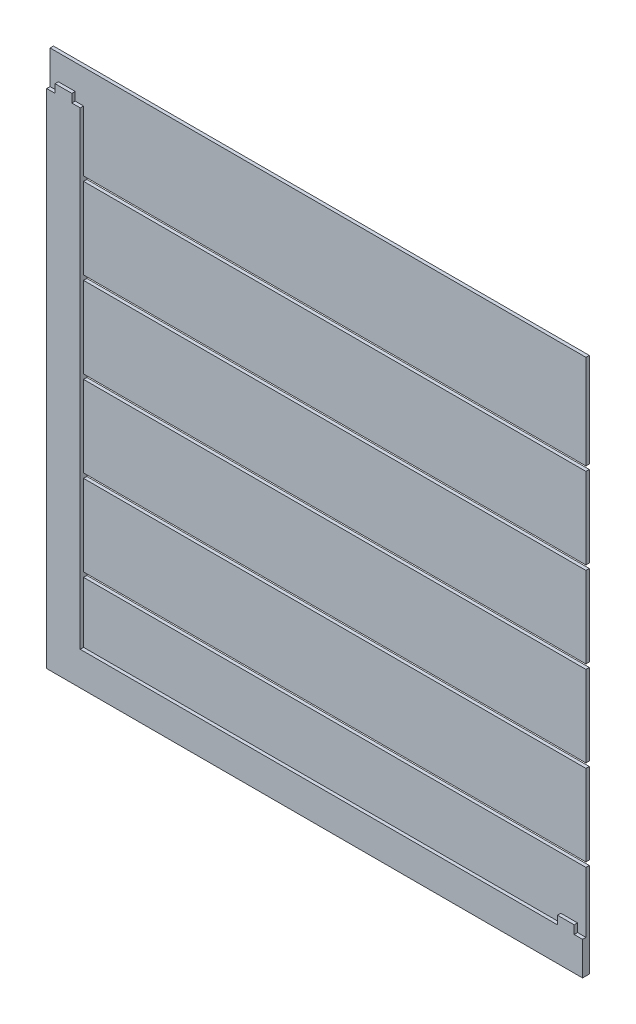
ISO-10303-21;
HEADER;
FILE_DESCRIPTION(('STEP AP214'),'2;1');
FILE_NAME('part.step','',(''),(''),'','','');
FILE_SCHEMA(('AUTOMOTIVE_DESIGN { 1 0 10303 214 1 1 1 1 }'));
ENDSEC;
DATA;
#1=APPLICATION_CONTEXT('core data for automotive mechanical design processes');
#2=APPLICATION_PROTOCOL_DEFINITION('international standard','automotive_design',2000,#1);
#3=PRODUCT_CONTEXT('',#1,'mechanical');
#4=PRODUCT('Part','Part','',(#3));
#5=PRODUCT_RELATED_PRODUCT_CATEGORY('part','',(#4));
#6=PRODUCT_DEFINITION_FORMATION('','',#4);
#7=PRODUCT_DEFINITION_CONTEXT('part definition',#1,'design');
#8=PRODUCT_DEFINITION('design','',#6,#7);
#9=PRODUCT_DEFINITION_SHAPE('','',#8);
#10=(LENGTH_UNIT() NAMED_UNIT(*) SI_UNIT(.MILLI.,.METRE.));
#11=(NAMED_UNIT(*) PLANE_ANGLE_UNIT() SI_UNIT($,.RADIAN.));
#12=(NAMED_UNIT(*) SI_UNIT($,.STERADIAN.) SOLID_ANGLE_UNIT());
#13=UNCERTAINTY_MEASURE_WITH_UNIT(LENGTH_MEASURE(1.E-05),#10,'distance_accuracy_value','');
#14=(GEOMETRIC_REPRESENTATION_CONTEXT(3) GLOBAL_UNCERTAINTY_ASSIGNED_CONTEXT((#13)) GLOBAL_UNIT_ASSIGNED_CONTEXT((#10,
#11,#12)) REPRESENTATION_CONTEXT('',''));
#15=CARTESIAN_POINT('',(0.,0.,0.));
#16=DIRECTION('',(0.,0.,1.));
#17=DIRECTION('',(1.,0.,0.));
#18=AXIS2_PLACEMENT_3D('',#15,#16,#17);
#19=CARTESIAN_POINT('',(0.,0.,1.));
#20=DIRECTION('',(0.,0.,1.));
#21=DIRECTION('',(1.,0.,0.));
#22=AXIS2_PLACEMENT_3D('',#19,#20,#21);
#23=PLANE('',#22);
#24=DIRECTION('',(0.,1.,0.));
#25=VECTOR('',#24,1.);
#26=CARTESIAN_POINT('',(-75.,-70.0313827048751,1.));
#27=LINE('',#26,#25);
#28=CARTESIAN_POINT('',(-75.,-50.5313827048751,1.));
#29=VERTEX_POINT('',#28);
#30=CARTESIAN_POINT('',(-75.,-26.3313827048751,1.));
#31=VERTEX_POINT('',#30);
#32=EDGE_CURVE('E11',#29,#31,#27,.T.);
#33=ORIENTED_EDGE('',*,*,#32,.F.);
#34=DIRECTION('',(1.,0.,0.));
#35=VECTOR('',#34,1.);
#36=CARTESIAN_POINT('',(0.,-50.5313827048751,1.));
#37=LINE('',#36,#35);
#38=CARTESIAN_POINT('',(75.,-50.5313827048751,1.));
#39=VERTEX_POINT('',#38);
#40=EDGE_CURVE('E389',#29,#39,#37,.T.);
#41=ORIENTED_EDGE('',*,*,#40,.T.);
#42=DIRECTION('',(0.,-1.,0.));
#43=VECTOR('',#42,1.);
#44=CARTESIAN_POINT('',(75.,0.,1.));
#45=LINE('',#44,#43);
#46=CARTESIAN_POINT('',(75.,-26.3313827048751,1.));
#47=VERTEX_POINT('',#46);
#48=EDGE_CURVE('E392',#47,#39,#45,.T.);
#49=ORIENTED_EDGE('',*,*,#48,.F.);
#50=DIRECTION('',(1.,0.,0.));
#51=VECTOR('',#50,1.);
#52=CARTESIAN_POINT('',(0.,-26.3313827048751,1.));
#53=LINE('',#52,#51);
#54=EDGE_CURVE('E395',#31,#47,#53,.T.);
#55=ORIENTED_EDGE('',*,*,#54,.F.);
#56=EDGE_LOOP('',(#33,#41,#49,#55));
#57=FACE_BOUND('',#56,.T.);
#58=ADVANCED_FACE('F38',(#57),#23,.T.);
#59=CARTESIAN_POINT('',(-75.,-24.9313827048751,1.));
#60=VERTEX_POINT('',#59);
#61=CARTESIAN_POINT('',(-75.,-0.731382704875112,1.));
#62=VERTEX_POINT('',#61);
#63=EDGE_CURVE('E47',#60,#62,#27,.T.);
#64=ORIENTED_EDGE('',*,*,#63,.F.);
#65=DIRECTION('',(1.,0.,0.));
#66=VECTOR('',#65,1.);
#67=CARTESIAN_POINT('',(0.,-24.9313827048751,1.));
#68=LINE('',#67,#66);
#69=CARTESIAN_POINT('',(75.,-24.9313827048751,1.));
#70=VERTEX_POINT('',#69);
#71=EDGE_CURVE('E398',#60,#70,#68,.T.);
#72=ORIENTED_EDGE('',*,*,#71,.T.);
#73=DIRECTION('',(0.,-1.,0.));
#74=VECTOR('',#73,1.);
#75=CARTESIAN_POINT('',(75.,0.,1.));
#76=LINE('',#75,#74);
#77=CARTESIAN_POINT('',(75.,-0.731382704875112,1.));
#78=VERTEX_POINT('',#77);
#79=EDGE_CURVE('E400',#78,#70,#76,.T.);
#80=ORIENTED_EDGE('',*,*,#79,.F.);
#81=DIRECTION('',(1.,0.,0.));
#82=VECTOR('',#81,1.);
#83=CARTESIAN_POINT('',(0.,-0.731382704875112,1.));
#84=LINE('',#83,#82);
#85=EDGE_CURVE('E403',#62,#78,#84,.T.);
#86=ORIENTED_EDGE('',*,*,#85,.F.);
#87=EDGE_LOOP('',(#64,#72,#80,#86));
#88=FACE_BOUND('',#87,.T.);
#89=ADVANCED_FACE('F561',(#88),#23,.T.);
#90=CARTESIAN_POINT('',(-75.,0.668617295124886,1.));
#91=VERTEX_POINT('',#90);
#92=CARTESIAN_POINT('',(-75.,24.8686172951249,1.));
#93=VERTEX_POINT('',#92);
#94=EDGE_CURVE('E550',#91,#93,#27,.T.);
#95=ORIENTED_EDGE('',*,*,#94,.F.);
#96=DIRECTION('',(1.,0.,0.));
#97=VECTOR('',#96,1.);
#98=CARTESIAN_POINT('',(0.,0.668617295124886,1.));
#99=LINE('',#98,#97);
#100=CARTESIAN_POINT('',(75.,0.668617295124886,1.));
#101=VERTEX_POINT('',#100);
#102=EDGE_CURVE('E406',#91,#101,#99,.T.);
#103=ORIENTED_EDGE('',*,*,#102,.T.);
#104=DIRECTION('',(0.,-1.,0.));
#105=VECTOR('',#104,1.);
#106=CARTESIAN_POINT('',(75.,0.,1.));
#107=LINE('',#106,#105);
#108=CARTESIAN_POINT('',(75.,24.8686172951249,1.));
#109=VERTEX_POINT('',#108);
#110=EDGE_CURVE('E408',#109,#101,#107,.T.);
#111=ORIENTED_EDGE('',*,*,#110,.F.);
#112=DIRECTION('',(1.,0.,0.));
#113=VECTOR('',#112,1.);
#114=CARTESIAN_POINT('',(0.,24.8686172951249,1.));
#115=LINE('',#114,#113);
#116=EDGE_CURVE('E411',#93,#109,#115,.T.);
#117=ORIENTED_EDGE('',*,*,#116,.F.);
#118=EDGE_LOOP('',(#95,#103,#111,#117));
#119=FACE_BOUND('',#118,.T.);
#120=ADVANCED_FACE('F578',(#119),#23,.T.);
#121=CARTESIAN_POINT('',(-75.,26.2686172951249,1.));
#122=VERTEX_POINT('',#121);
#123=CARTESIAN_POINT('',(-75.,50.4686172951249,1.));
#124=VERTEX_POINT('',#123);
#125=EDGE_CURVE('E546',#122,#124,#27,.T.);
#126=ORIENTED_EDGE('',*,*,#125,.F.);
#127=DIRECTION('',(1.,0.,0.));
#128=VECTOR('',#127,1.);
#129=CARTESIAN_POINT('',(0.,26.2686172951249,1.));
#130=LINE('',#129,#128);
#131=CARTESIAN_POINT('',(75.,26.2686172951249,1.));
#132=VERTEX_POINT('',#131);
#133=EDGE_CURVE('E414',#122,#132,#130,.T.);
#134=ORIENTED_EDGE('',*,*,#133,.T.);
#135=DIRECTION('',(0.,-1.,0.));
#136=VECTOR('',#135,1.);
#137=CARTESIAN_POINT('',(75.,0.,1.));
#138=LINE('',#137,#136);
#139=CARTESIAN_POINT('',(75.,50.4686172951249,1.));
#140=VERTEX_POINT('',#139);
#141=EDGE_CURVE('E416',#140,#132,#138,.T.);
#142=ORIENTED_EDGE('',*,*,#141,.F.);
#143=DIRECTION('',(1.,0.,0.));
#144=VECTOR('',#143,1.);
#145=CARTESIAN_POINT('',(0.,50.4686172951249,1.));
#146=LINE('',#145,#144);
#147=EDGE_CURVE('E419',#124,#140,#146,.T.);
#148=ORIENTED_EDGE('',*,*,#147,.F.);
#149=EDGE_LOOP('',(#126,#134,#142,#148));
#150=FACE_BOUND('',#149,.T.);
#151=ADVANCED_FACE('F593',(#150),#23,.T.);
#152=DIRECTION('',(-1.,0.,0.));
#153=VECTOR('',#152,1.);
#154=CARTESIAN_POINT('',(-85.,69.9686172951249,1.));
#155=LINE('',#154,#153);
#156=CARTESIAN_POINT('',(-82.5,69.9686172951249,1.));
#157=VERTEX_POINT('',#156);
#158=CARTESIAN_POINT('',(-85.,69.9686172951249,1.));
#159=VERTEX_POINT('',#158);
#160=EDGE_CURVE('E56',#157,#159,#155,.T.);
#161=ORIENTED_EDGE('',*,*,#160,.F.);
#162=DIRECTION('',(0.,-1.,0.));
#163=VECTOR('',#162,1.);
#164=CARTESIAN_POINT('',(-82.5,69.9686172951249,1.));
#165=LINE('',#164,#163);
#166=CARTESIAN_POINT('',(-82.5,72.468617295125,1.));
#167=VERTEX_POINT('',#166);
#168=EDGE_CURVE('E60',#167,#157,#165,.T.);
#169=ORIENTED_EDGE('',*,*,#168,.F.);
#170=DIRECTION('',(-1.,0.,0.));
#171=VECTOR('',#170,1.);
#172=CARTESIAN_POINT('',(-82.5,72.468617295125,1.));
#173=LINE('',#172,#171);
#174=CARTESIAN_POINT('',(-77.5,72.468617295125,1.));
#175=VERTEX_POINT('',#174);
#176=EDGE_CURVE('E349',#175,#167,#173,.T.);
#177=ORIENTED_EDGE('',*,*,#176,.F.);
#178=DIRECTION('',(0.,1.,0.));
#179=VECTOR('',#178,1.);
#180=CARTESIAN_POINT('',(-77.5,69.9686172951249,1.));
#181=LINE('',#180,#179);
#182=CARTESIAN_POINT('',(-77.5,69.9686172951249,1.));
#183=VERTEX_POINT('',#182);
#184=EDGE_CURVE('E346',#183,#175,#181,.T.);
#185=ORIENTED_EDGE('',*,*,#184,.F.);
#186=DIRECTION('',(-1.,0.,0.));
#187=VECTOR('',#186,1.);
#188=CARTESIAN_POINT('',(-77.5,69.9686172951249,1.));
#189=LINE('',#188,#187);
#190=CARTESIAN_POINT('',(-75.,69.9686172951249,1.));
#191=VERTEX_POINT('',#190);
#192=EDGE_CURVE('E342',#191,#183,#189,.T.);
#193=ORIENTED_EDGE('',*,*,#192,.F.);
#194=CARTESIAN_POINT('',(-75.,51.8686172951249,1.));
#195=VERTEX_POINT('',#194);
#196=EDGE_CURVE('E343',#195,#191,#27,.T.);
#197=ORIENTED_EDGE('',*,*,#196,.F.);
#198=DIRECTION('',(1.,0.,0.));
#199=VECTOR('',#198,1.);
#200=CARTESIAN_POINT('',(0.,51.8686172951249,1.));
#201=LINE('',#200,#199);
#202=CARTESIAN_POINT('',(75.,51.8686172951249,1.));
#203=VERTEX_POINT('',#202);
#204=EDGE_CURVE('E422',#195,#203,#201,.T.);
#205=ORIENTED_EDGE('',*,*,#204,.T.);
#206=DIRECTION('',(0.,-1.,0.));
#207=VECTOR('',#206,1.);
#208=CARTESIAN_POINT('',(75.,0.,1.));
#209=LINE('',#208,#207);
#210=CARTESIAN_POINT('',(75.,79.9686172951249,1.));
#211=VERTEX_POINT('',#210);
#212=EDGE_CURVE('E424',#211,#203,#209,.T.);
#213=ORIENTED_EDGE('',*,*,#212,.F.);
#214=DIRECTION('',(-1.,0.,0.));
#215=VECTOR('',#214,1.);
#216=CARTESIAN_POINT('',(0.,79.9686172951249,1.));
#217=LINE('',#216,#215);
#218=CARTESIAN_POINT('',(-85.,79.9686172951249,1.));
#219=VERTEX_POINT('',#218);
#220=EDGE_CURVE('E427',#211,#219,#217,.T.);
#221=ORIENTED_EDGE('',*,*,#220,.T.);
#222=DIRECTION('',(0.,-1.,0.));
#223=VECTOR('',#222,1.);
#224=CARTESIAN_POINT('',(-85.,0.,1.));
#225=LINE('',#224,#223);
#226=EDGE_CURVE('E429',#219,#159,#225,.T.);
#227=ORIENTED_EDGE('',*,*,#226,.T.);
#228=EDGE_LOOP('',(#161,#169,#177,#185,#193,#197,#205,#213,#221,#227));
#229=FACE_BOUND('',#228,.T.);
#230=ADVANCED_FACE('F607',(#229),#23,.T.);
#231=CARTESIAN_POINT('',(0.,-51.9313827048751,1.));
#232=DIRECTION('',(0.,1.,0.));
#233=DIRECTION('',(0.,0.,1.));
#234=AXIS2_PLACEMENT_3D('',#231,#232,#233);
#235=PLANE('',#234);
#236=DIRECTION('',(1.,0.,0.));
#237=VECTOR('',#236,1.);
#238=CARTESIAN_POINT('',(0.,-51.9313827048751,0.));
#239=LINE('',#238,#237);
#240=CARTESIAN_POINT('',(-75.,-51.9313827048751,0.));
#241=VERTEX_POINT('',#240);
#242=CARTESIAN_POINT('',(75.,-51.9313827048751,0.));
#243=VERTEX_POINT('',#242);
#244=EDGE_CURVE('E385',#241,#243,#239,.T.);
#245=ORIENTED_EDGE('',*,*,#244,.F.);
#246=DIRECTION('',(0.,0.,-1.));
#247=VECTOR('',#246,1.);
#248=CARTESIAN_POINT('',(-75.,-51.9313827048751,1.));
#249=LINE('',#248,#247);
#250=CARTESIAN_POINT('',(-75.,-51.9313827048751,1.));
#251=VERTEX_POINT('',#250);
#252=EDGE_CURVE('E42',#251,#241,#249,.T.);
#253=ORIENTED_EDGE('',*,*,#252,.F.);
#254=DIRECTION('',(1.,0.,0.));
#255=VECTOR('',#254,1.);
#256=CARTESIAN_POINT('',(0.,-51.9313827048751,1.));
#257=LINE('',#256,#255);
#258=CARTESIAN_POINT('',(75.,-51.9313827048751,1.));
#259=VERTEX_POINT('',#258);
#260=EDGE_CURVE('E386',#251,#259,#257,.T.);
#261=ORIENTED_EDGE('',*,*,#260,.T.);
#262=DIRECTION('',(0.,0.,-1.));
#263=VECTOR('',#262,1.);
#264=CARTESIAN_POINT('',(75.,-51.9313827048751,1.));
#265=LINE('',#264,#263);
#266=EDGE_CURVE('E284',#259,#243,#265,.T.);
#267=ORIENTED_EDGE('',*,*,#266,.T.);
#268=EDGE_LOOP('',(#245,#253,#261,#267));
#269=FACE_BOUND('',#268,.T.);
#270=ADVANCED_FACE('F40',(#269),#235,.T.);
#271=CARTESIAN_POINT('',(0.,-50.5313827048751,1.));
#272=DIRECTION('',(0.,1.,0.));
#273=DIRECTION('',(0.,0.,1.));
#274=AXIS2_PLACEMENT_3D('',#271,#272,#273);
#275=PLANE('',#274);
#276=DIRECTION('',(1.,0.,0.));
#277=VECTOR('',#276,1.);
#278=CARTESIAN_POINT('',(0.,-50.5313827048751,0.));
#279=LINE('',#278,#277);
#280=CARTESIAN_POINT('',(-75.,-50.5313827048751,0.));
#281=VERTEX_POINT('',#280);
#282=CARTESIAN_POINT('',(75.,-50.5313827048751,0.));
#283=VERTEX_POINT('',#282);
#284=EDGE_CURVE('E437',#281,#283,#279,.T.);
#285=ORIENTED_EDGE('',*,*,#284,.T.);
#286=DIRECTION('',(0.,0.,-1.));
#287=VECTOR('',#286,1.);
#288=CARTESIAN_POINT('',(75.,-50.5313827048751,1.));
#289=LINE('',#288,#287);
#290=EDGE_CURVE('E536',#39,#283,#289,.T.);
#291=ORIENTED_EDGE('',*,*,#290,.F.);
#292=ORIENTED_EDGE('',*,*,#40,.F.);
#293=DIRECTION('',(0.,0.,-1.));
#294=VECTOR('',#293,1.);
#295=CARTESIAN_POINT('',(-75.,-50.5313827048751,1.));
#296=LINE('',#295,#294);
#297=EDGE_CURVE('E537',#29,#281,#296,.T.);
#298=ORIENTED_EDGE('',*,*,#297,.T.);
#299=EDGE_LOOP('',(#285,#291,#292,#298));
#300=FACE_BOUND('',#299,.T.);
#301=ADVANCED_FACE('F645',(#300),#275,.F.);
#302=CARTESIAN_POINT('',(75.,0.,1.));
#303=DIRECTION('',(1.,0.,0.));
#304=DIRECTION('',(0.,0.,-1.));
#305=AXIS2_PLACEMENT_3D('',#302,#303,#304);
#306=PLANE('',#305);
#307=DIRECTION('',(0.,-1.,0.));
#308=VECTOR('',#307,1.);
#309=CARTESIAN_POINT('',(75.,0.,0.));
#310=LINE('',#309,#308);
#311=CARTESIAN_POINT('',(75.,-26.3313827048751,0.));
#312=VERTEX_POINT('',#311);
#313=EDGE_CURVE('E440',#312,#283,#310,.T.);
#314=ORIENTED_EDGE('',*,*,#313,.F.);
#315=DIRECTION('',(0.,0.,-1.));
#316=VECTOR('',#315,1.);
#317=CARTESIAN_POINT('',(75.,-26.3313827048751,1.));
#318=LINE('',#317,#316);
#319=EDGE_CURVE('E534',#47,#312,#318,.T.);
#320=ORIENTED_EDGE('',*,*,#319,.F.);
#321=ORIENTED_EDGE('',*,*,#48,.T.);
#322=ORIENTED_EDGE('',*,*,#290,.T.);
#323=EDGE_LOOP('',(#314,#320,#321,#322));
#324=FACE_BOUND('',#323,.T.);
#325=ADVANCED_FACE('F771',(#324),#306,.T.);
#326=CARTESIAN_POINT('',(0.,-26.3313827048751,1.));
#327=DIRECTION('',(0.,1.,0.));
#328=DIRECTION('',(0.,0.,1.));
#329=AXIS2_PLACEMENT_3D('',#326,#327,#328);
#330=PLANE('',#329);
#331=DIRECTION('',(1.,0.,0.));
#332=VECTOR('',#331,1.);
#333=CARTESIAN_POINT('',(0.,-26.3313827048751,0.));
#334=LINE('',#333,#332);
#335=CARTESIAN_POINT('',(-75.,-26.3313827048751,0.));
#336=VERTEX_POINT('',#335);
#337=EDGE_CURVE('E443',#336,#312,#334,.T.);
#338=ORIENTED_EDGE('',*,*,#337,.F.);
#339=DIRECTION('',(0.,0.,-1.));
#340=VECTOR('',#339,1.);
#341=CARTESIAN_POINT('',(-75.,-26.3313827048751,1.));
#342=LINE('',#341,#340);
#343=EDGE_CURVE('E532',#31,#336,#342,.T.);
#344=ORIENTED_EDGE('',*,*,#343,.F.);
#345=ORIENTED_EDGE('',*,*,#54,.T.);
#346=ORIENTED_EDGE('',*,*,#319,.T.);
#347=EDGE_LOOP('',(#338,#344,#345,#346));
#348=FACE_BOUND('',#347,.T.);
#349=ADVANCED_FACE('F651',(#348),#330,.T.);
#350=CARTESIAN_POINT('',(0.,-24.9313827048751,1.));
#351=DIRECTION('',(0.,1.,0.));
#352=DIRECTION('',(0.,0.,1.));
#353=AXIS2_PLACEMENT_3D('',#350,#351,#352);
#354=PLANE('',#353);
#355=DIRECTION('',(1.,0.,0.));
#356=VECTOR('',#355,1.);
#357=CARTESIAN_POINT('',(0.,-24.9313827048751,0.));
#358=LINE('',#357,#356);
#359=CARTESIAN_POINT('',(-75.,-24.9313827048751,0.));
#360=VERTEX_POINT('',#359);
#361=CARTESIAN_POINT('',(75.,-24.9313827048751,0.));
#362=VERTEX_POINT('',#361);
#363=EDGE_CURVE('E448',#360,#362,#358,.T.);
#364=ORIENTED_EDGE('',*,*,#363,.T.);
#365=DIRECTION('',(0.,0.,-1.));
#366=VECTOR('',#365,1.);
#367=CARTESIAN_POINT('',(75.,-24.9313827048751,1.));
#368=LINE('',#367,#366);
#369=EDGE_CURVE('E527',#70,#362,#368,.T.);
#370=ORIENTED_EDGE('',*,*,#369,.F.);
#371=ORIENTED_EDGE('',*,*,#71,.F.);
#372=DIRECTION('',(0.,0.,-1.));
#373=VECTOR('',#372,1.);
#374=CARTESIAN_POINT('',(-75.,-24.9313827048751,1.));
#375=LINE('',#374,#373);
#376=EDGE_CURVE('E529',#60,#360,#375,.T.);
#377=ORIENTED_EDGE('',*,*,#376,.T.);
#378=EDGE_LOOP('',(#364,#370,#371,#377));
#379=FACE_BOUND('',#378,.T.);
#380=ADVANCED_FACE('F655',(#379),#354,.F.);
#381=CARTESIAN_POINT('',(75.,0.,1.));
#382=DIRECTION('',(1.,0.,0.));
#383=DIRECTION('',(0.,1.,0.));
#384=AXIS2_PLACEMENT_3D('',#381,#382,#383);
#385=PLANE('',#384);
#386=DIRECTION('',(0.,-1.,0.));
#387=VECTOR('',#386,1.);
#388=CARTESIAN_POINT('',(75.,0.,0.));
#389=LINE('',#388,#387);
#390=CARTESIAN_POINT('',(75.,-0.731382704875112,0.));
#391=VERTEX_POINT('',#390);
#392=EDGE_CURVE('E451',#391,#362,#389,.T.);
#393=ORIENTED_EDGE('',*,*,#392,.F.);
#394=DIRECTION('',(0.,0.,-1.));
#395=VECTOR('',#394,1.);
#396=CARTESIAN_POINT('',(75.,-0.731382704875112,1.));
#397=LINE('',#396,#395);
#398=EDGE_CURVE('E525',#78,#391,#397,.T.);
#399=ORIENTED_EDGE('',*,*,#398,.F.);
#400=ORIENTED_EDGE('',*,*,#79,.T.);
#401=ORIENTED_EDGE('',*,*,#369,.T.);
#402=EDGE_LOOP('',(#393,#399,#400,#401));
#403=FACE_BOUND('',#402,.T.);
#404=ADVANCED_FACE('F657',(#403),#385,.T.);
#405=CARTESIAN_POINT('',(0.,-0.731382704875112,1.));
#406=DIRECTION('',(0.,1.,0.));
#407=DIRECTION('',(0.,0.,1.));
#408=AXIS2_PLACEMENT_3D('',#405,#406,#407);
#409=PLANE('',#408);
#410=DIRECTION('',(1.,0.,0.));
#411=VECTOR('',#410,1.);
#412=CARTESIAN_POINT('',(0.,-0.731382704875112,0.));
#413=LINE('',#412,#411);
#414=CARTESIAN_POINT('',(-75.,-0.731382704875112,0.));
#415=VERTEX_POINT('',#414);
#416=EDGE_CURVE('E454',#415,#391,#413,.T.);
#417=ORIENTED_EDGE('',*,*,#416,.F.);
#418=DIRECTION('',(0.,0.,-1.));
#419=VECTOR('',#418,1.);
#420=CARTESIAN_POINT('',(-75.,-0.731382704875112,1.));
#421=LINE('',#420,#419);
#422=EDGE_CURVE('E523',#62,#415,#421,.T.);
#423=ORIENTED_EDGE('',*,*,#422,.F.);
#424=ORIENTED_EDGE('',*,*,#85,.T.);
#425=ORIENTED_EDGE('',*,*,#398,.T.);
#426=EDGE_LOOP('',(#417,#423,#424,#425));
#427=FACE_BOUND('',#426,.T.);
#428=ADVANCED_FACE('F566',(#427),#409,.T.);
#429=CARTESIAN_POINT('',(0.,0.668617295124886,1.));
#430=DIRECTION('',(0.,1.,0.));
#431=DIRECTION('',(0.,0.,1.));
#432=AXIS2_PLACEMENT_3D('',#429,#430,#431);
#433=PLANE('',#432);
#434=DIRECTION('',(1.,0.,0.));
#435=VECTOR('',#434,1.);
#436=CARTESIAN_POINT('',(0.,0.668617295124886,0.));
#437=LINE('',#436,#435);
#438=CARTESIAN_POINT('',(-75.,0.668617295124886,0.));
#439=VERTEX_POINT('',#438);
#440=CARTESIAN_POINT('',(75.,0.668617295124886,0.));
#441=VERTEX_POINT('',#440);
#442=EDGE_CURVE('E459',#439,#441,#437,.T.);
#443=ORIENTED_EDGE('',*,*,#442,.T.);
#444=DIRECTION('',(0.,0.,-1.));
#445=VECTOR('',#444,1.);
#446=CARTESIAN_POINT('',(75.,0.668617295124886,1.));
#447=LINE('',#446,#445);
#448=EDGE_CURVE('E518',#101,#441,#447,.T.);
#449=ORIENTED_EDGE('',*,*,#448,.F.);
#450=ORIENTED_EDGE('',*,*,#102,.F.);
#451=DIRECTION('',(0.,0.,-1.));
#452=VECTOR('',#451,1.);
#453=CARTESIAN_POINT('',(-75.,0.668617295124886,1.));
#454=LINE('',#453,#452);
#455=EDGE_CURVE('E520',#91,#439,#454,.T.);
#456=ORIENTED_EDGE('',*,*,#455,.T.);
#457=EDGE_LOOP('',(#443,#449,#450,#456));
#458=FACE_BOUND('',#457,.T.);
#459=ADVANCED_FACE('F574',(#458),#433,.F.);
#460=CARTESIAN_POINT('',(75.,0.,1.));
#461=DIRECTION('',(1.,0.,0.));
#462=DIRECTION('',(0.,0.,-1.));
#463=AXIS2_PLACEMENT_3D('',#460,#461,#462);
#464=PLANE('',#463);
#465=DIRECTION('',(0.,-1.,0.));
#466=VECTOR('',#465,1.);
#467=CARTESIAN_POINT('',(75.,0.,0.));
#468=LINE('',#467,#466);
#469=CARTESIAN_POINT('',(75.,24.8686172951249,0.));
#470=VERTEX_POINT('',#469);
#471=EDGE_CURVE('E462',#470,#441,#468,.T.);
#472=ORIENTED_EDGE('',*,*,#471,.F.);
#473=DIRECTION('',(0.,0.,-1.));
#474=VECTOR('',#473,1.);
#475=CARTESIAN_POINT('',(75.,24.8686172951249,1.));
#476=LINE('',#475,#474);
#477=EDGE_CURVE('E516',#109,#470,#476,.T.);
#478=ORIENTED_EDGE('',*,*,#477,.F.);
#479=ORIENTED_EDGE('',*,*,#110,.T.);
#480=ORIENTED_EDGE('',*,*,#448,.T.);
#481=EDGE_LOOP('',(#472,#478,#479,#480));
#482=FACE_BOUND('',#481,.T.);
#483=ADVANCED_FACE('F751',(#482),#464,.T.);
#484=CARTESIAN_POINT('',(0.,24.8686172951249,1.));
#485=DIRECTION('',(0.,1.,0.));
#486=DIRECTION('',(0.,0.,1.));
#487=AXIS2_PLACEMENT_3D('',#484,#485,#486);
#488=PLANE('',#487);
#489=DIRECTION('',(1.,0.,0.));
#490=VECTOR('',#489,1.);
#491=CARTESIAN_POINT('',(0.,24.8686172951249,0.));
#492=LINE('',#491,#490);
#493=CARTESIAN_POINT('',(-75.,24.8686172951249,0.));
#494=VERTEX_POINT('',#493);
#495=EDGE_CURVE('E465',#494,#470,#492,.T.);
#496=ORIENTED_EDGE('',*,*,#495,.F.);
#497=DIRECTION('',(0.,0.,-1.));
#498=VECTOR('',#497,1.);
#499=CARTESIAN_POINT('',(-75.,24.8686172951249,1.));
#500=LINE('',#499,#498);
#501=EDGE_CURVE('E514',#93,#494,#500,.T.);
#502=ORIENTED_EDGE('',*,*,#501,.F.);
#503=ORIENTED_EDGE('',*,*,#116,.T.);
#504=ORIENTED_EDGE('',*,*,#477,.T.);
#505=EDGE_LOOP('',(#496,#502,#503,#504));
#506=FACE_BOUND('',#505,.T.);
#507=ADVANCED_FACE('F582',(#506),#488,.T.);
#508=CARTESIAN_POINT('',(0.,26.2686172951249,1.));
#509=DIRECTION('',(0.,1.,0.));
#510=DIRECTION('',(0.,0.,1.));
#511=AXIS2_PLACEMENT_3D('',#508,#509,#510);
#512=PLANE('',#511);
#513=DIRECTION('',(1.,0.,0.));
#514=VECTOR('',#513,1.);
#515=CARTESIAN_POINT('',(0.,26.2686172951249,0.));
#516=LINE('',#515,#514);
#517=CARTESIAN_POINT('',(-75.,26.2686172951249,0.));
#518=VERTEX_POINT('',#517);
#519=CARTESIAN_POINT('',(75.,26.2686172951249,0.));
#520=VERTEX_POINT('',#519);
#521=EDGE_CURVE('E470',#518,#520,#516,.T.);
#522=ORIENTED_EDGE('',*,*,#521,.T.);
#523=DIRECTION('',(0.,0.,-1.));
#524=VECTOR('',#523,1.);
#525=CARTESIAN_POINT('',(75.,26.2686172951249,1.));
#526=LINE('',#525,#524);
#527=EDGE_CURVE('E509',#132,#520,#526,.T.);
#528=ORIENTED_EDGE('',*,*,#527,.F.);
#529=ORIENTED_EDGE('',*,*,#133,.F.);
#530=DIRECTION('',(0.,0.,-1.));
#531=VECTOR('',#530,1.);
#532=CARTESIAN_POINT('',(-75.,26.2686172951249,1.));
#533=LINE('',#532,#531);
#534=EDGE_CURVE('E511',#122,#518,#533,.T.);
#535=ORIENTED_EDGE('',*,*,#534,.T.);
#536=EDGE_LOOP('',(#522,#528,#529,#535));
#537=FACE_BOUND('',#536,.T.);
#538=ADVANCED_FACE('F589',(#537),#512,.F.);
#539=CARTESIAN_POINT('',(75.,0.,1.));
#540=DIRECTION('',(1.,0.,0.));
#541=DIRECTION('',(0.,0.,-1.));
#542=AXIS2_PLACEMENT_3D('',#539,#540,#541);
#543=PLANE('',#542);
#544=DIRECTION('',(0.,-1.,0.));
#545=VECTOR('',#544,1.);
#546=CARTESIAN_POINT('',(75.,0.,0.));
#547=LINE('',#546,#545);
#548=CARTESIAN_POINT('',(75.,50.4686172951249,0.));
#549=VERTEX_POINT('',#548);
#550=EDGE_CURVE('E473',#549,#520,#547,.T.);
#551=ORIENTED_EDGE('',*,*,#550,.F.);
#552=DIRECTION('',(0.,0.,-1.));
#553=VECTOR('',#552,1.);
#554=CARTESIAN_POINT('',(75.,50.4686172951249,1.));
#555=LINE('',#554,#553);
#556=EDGE_CURVE('E507',#140,#549,#555,.T.);
#557=ORIENTED_EDGE('',*,*,#556,.F.);
#558=ORIENTED_EDGE('',*,*,#141,.T.);
#559=ORIENTED_EDGE('',*,*,#527,.T.);
#560=EDGE_LOOP('',(#551,#557,#558,#559));
#561=FACE_BOUND('',#560,.T.);
#562=ADVANCED_FACE('F737',(#561),#543,.T.);
#563=CARTESIAN_POINT('',(0.,50.4686172951249,1.));
#564=DIRECTION('',(0.,1.,0.));
#565=DIRECTION('',(0.,0.,1.));
#566=AXIS2_PLACEMENT_3D('',#563,#564,#565);
#567=PLANE('',#566);
#568=DIRECTION('',(1.,0.,0.));
#569=VECTOR('',#568,1.);
#570=CARTESIAN_POINT('',(0.,50.4686172951249,0.));
#571=LINE('',#570,#569);
#572=CARTESIAN_POINT('',(-75.,50.4686172951249,0.));
#573=VERTEX_POINT('',#572);
#574=EDGE_CURVE('E476',#573,#549,#571,.T.);
#575=ORIENTED_EDGE('',*,*,#574,.F.);
#576=DIRECTION('',(0.,0.,-1.));
#577=VECTOR('',#576,1.);
#578=CARTESIAN_POINT('',(-75.,50.4686172951249,1.));
#579=LINE('',#578,#577);
#580=EDGE_CURVE('E505',#124,#573,#579,.T.);
#581=ORIENTED_EDGE('',*,*,#580,.F.);
#582=ORIENTED_EDGE('',*,*,#147,.T.);
#583=ORIENTED_EDGE('',*,*,#556,.T.);
#584=EDGE_LOOP('',(#575,#581,#582,#583));
#585=FACE_BOUND('',#584,.T.);
#586=ADVANCED_FACE('F597',(#585),#567,.T.);
#587=CARTESIAN_POINT('',(-75.,0.,1.));
#588=DIRECTION('',(-1.,0.,0.));
#589=DIRECTION('',(0.,0.,1.));
#590=AXIS2_PLACEMENT_3D('',#587,#588,#589);
#591=PLANE('',#590);
#592=DIRECTION('',(0.,1.,0.));
#593=VECTOR('',#592,1.);
#594=CARTESIAN_POINT('',(-75.,0.,0.));
#595=LINE('',#594,#593);
#596=CARTESIAN_POINT('',(-75.,51.8686172951249,0.));
#597=VERTEX_POINT('',#596);
#598=EDGE_CURVE('E479',#573,#597,#595,.T.);
#599=ORIENTED_EDGE('',*,*,#598,.T.);
#600=DIRECTION('',(0.,0.,-1.));
#601=VECTOR('',#600,1.);
#602=CARTESIAN_POINT('',(-75.,51.8686172951249,1.));
#603=LINE('',#602,#601);
#604=EDGE_CURVE('E502',#195,#597,#603,.T.);
#605=ORIENTED_EDGE('',*,*,#604,.F.);
#606=ORIENTED_EDGE('',*,*,#196,.T.);
#607=DIRECTION('',(0.,0.,-1.));
#608=VECTOR('',#607,1.);
#609=CARTESIAN_POINT('',(-75.,69.9686172951249,2.));
#610=LINE('',#609,#608);
#611=CARTESIAN_POINT('',(-75.,69.9686172951249,2.));
#612=VERTEX_POINT('',#611);
#613=EDGE_CURVE('E366',#612,#191,#610,.T.);
#614=ORIENTED_EDGE('',*,*,#613,.F.);
#615=DIRECTION('',(0.,1.,0.));
#616=VECTOR('',#615,1.);
#617=CARTESIAN_POINT('',(-75.,-70.0313827048751,2.));
#618=LINE('',#617,#616);
#619=CARTESIAN_POINT('',(-75.,-70.0313827048751,2.));
#620=VERTEX_POINT('',#619);
#621=EDGE_CURVE('E312',#620,#612,#618,.T.);
#622=ORIENTED_EDGE('',*,*,#621,.F.);
#623=DIRECTION('',(0.,0.,-1.));
#624=VECTOR('',#623,1.);
#625=CARTESIAN_POINT('',(-75.,-70.0313827048751,2.));
#626=LINE('',#625,#624);
#627=CARTESIAN_POINT('',(-75.,-70.0313827048751,1.));
#628=VERTEX_POINT('',#627);
#629=EDGE_CURVE('E369',#620,#628,#626,.T.);
#630=ORIENTED_EDGE('',*,*,#629,.T.);
#631=EDGE_CURVE('E49',#628,#251,#27,.T.);
#632=ORIENTED_EDGE('',*,*,#631,.T.);
#633=ORIENTED_EDGE('',*,*,#252,.T.);
#634=DIRECTION('',(0.,1.,0.));
#635=VECTOR('',#634,1.);
#636=CARTESIAN_POINT('',(-75.,0.,0.));
#637=LINE('',#636,#635);
#638=EDGE_CURVE('E435',#241,#281,#637,.T.);
#639=ORIENTED_EDGE('',*,*,#638,.T.);
#640=ORIENTED_EDGE('',*,*,#297,.F.);
#641=ORIENTED_EDGE('',*,*,#32,.T.);
#642=ORIENTED_EDGE('',*,*,#343,.T.);
#643=DIRECTION('',(0.,1.,0.));
#644=VECTOR('',#643,1.);
#645=CARTESIAN_POINT('',(-75.,0.,0.));
#646=LINE('',#645,#644);
#647=EDGE_CURVE('E446',#336,#360,#646,.T.);
#648=ORIENTED_EDGE('',*,*,#647,.T.);
#649=ORIENTED_EDGE('',*,*,#376,.F.);
#650=ORIENTED_EDGE('',*,*,#63,.T.);
#651=ORIENTED_EDGE('',*,*,#422,.T.);
#652=DIRECTION('',(0.,1.,0.));
#653=VECTOR('',#652,1.);
#654=CARTESIAN_POINT('',(-75.,0.,0.));
#655=LINE('',#654,#653);
#656=EDGE_CURVE('E457',#415,#439,#655,.T.);
#657=ORIENTED_EDGE('',*,*,#656,.T.);
#658=ORIENTED_EDGE('',*,*,#455,.F.);
#659=ORIENTED_EDGE('',*,*,#94,.T.);
#660=ORIENTED_EDGE('',*,*,#501,.T.);
#661=DIRECTION('',(0.,1.,0.));
#662=VECTOR('',#661,1.);
#663=CARTESIAN_POINT('',(-75.,0.,0.));
#664=LINE('',#663,#662);
#665=EDGE_CURVE('E468',#494,#518,#664,.T.);
#666=ORIENTED_EDGE('',*,*,#665,.T.);
#667=ORIENTED_EDGE('',*,*,#534,.F.);
#668=ORIENTED_EDGE('',*,*,#125,.T.);
#669=ORIENTED_EDGE('',*,*,#580,.T.);
#670=EDGE_LOOP('',(#599,#605,#606,#614,#622,#630,#632,#633,#639,#640,#641,#642,#648,#649,#650,
#651,#657,#658,#659,#660,#666,#667,#668,#669));
#671=FACE_BOUND('',#670,.T.);
#672=ADVANCED_FACE('F556',(#671),#591,.F.);
#673=CARTESIAN_POINT('',(0.,51.8686172951249,1.));
#674=DIRECTION('',(0.,1.,0.));
#675=DIRECTION('',(0.,0.,1.));
#676=AXIS2_PLACEMENT_3D('',#673,#674,#675);
#677=PLANE('',#676);
#678=DIRECTION('',(1.,0.,0.));
#679=VECTOR('',#678,1.);
#680=CARTESIAN_POINT('',(0.,51.8686172951249,0.));
#681=LINE('',#680,#679);
#682=CARTESIAN_POINT('',(75.,51.8686172951249,0.));
#683=VERTEX_POINT('',#682);
#684=EDGE_CURVE('E481',#597,#683,#681,.T.);
#685=ORIENTED_EDGE('',*,*,#684,.T.);
#686=DIRECTION('',(0.,0.,-1.));
#687=VECTOR('',#686,1.);
#688=CARTESIAN_POINT('',(75.,51.8686172951249,1.));
#689=LINE('',#688,#687);
#690=EDGE_CURVE('E500',#203,#683,#689,.T.);
#691=ORIENTED_EDGE('',*,*,#690,.F.);
#692=ORIENTED_EDGE('',*,*,#204,.F.);
#693=ORIENTED_EDGE('',*,*,#604,.T.);
#694=EDGE_LOOP('',(#685,#691,#692,#693));
#695=FACE_BOUND('',#694,.T.);
#696=ADVANCED_FACE('F604',(#695),#677,.F.);
#697=CARTESIAN_POINT('',(75.,0.,1.));
#698=DIRECTION('',(1.,0.,0.));
#699=DIRECTION('',(0.,1.,0.));
#700=AXIS2_PLACEMENT_3D('',#697,#698,#699);
#701=PLANE('',#700);
#702=DIRECTION('',(0.,-1.,0.));
#703=VECTOR('',#702,1.);
#704=CARTESIAN_POINT('',(75.,0.,0.));
#705=LINE('',#704,#703);
#706=CARTESIAN_POINT('',(75.,79.9686172951249,0.));
#707=VERTEX_POINT('',#706);
#708=EDGE_CURVE('E484',#707,#683,#705,.T.);
#709=ORIENTED_EDGE('',*,*,#708,.F.);
#710=DIRECTION('',(0.,0.,-1.));
#711=VECTOR('',#710,1.);
#712=CARTESIAN_POINT('',(75.,79.9686172951249,1.));
#713=LINE('',#712,#711);
#714=EDGE_CURVE('E498',#211,#707,#713,.T.);
#715=ORIENTED_EDGE('',*,*,#714,.F.);
#716=ORIENTED_EDGE('',*,*,#212,.T.);
#717=ORIENTED_EDGE('',*,*,#690,.T.);
#718=EDGE_LOOP('',(#709,#715,#716,#717));
#719=FACE_BOUND('',#718,.T.);
#720=ADVANCED_FACE('F718',(#719),#701,.T.);
#721=CARTESIAN_POINT('',(0.,79.9686172951249,1.));
#722=DIRECTION('',(0.,-1.,0.));
#723=DIRECTION('',(1.,0.,0.));
#724=AXIS2_PLACEMENT_3D('',#721,#722,#723);
#725=PLANE('',#724);
#726=DIRECTION('',(-1.,0.,0.));
#727=VECTOR('',#726,1.);
#728=CARTESIAN_POINT('',(0.,79.9686172951249,0.));
#729=LINE('',#728,#727);
#730=CARTESIAN_POINT('',(-85.,79.9686172951249,0.));
#731=VERTEX_POINT('',#730);
#732=EDGE_CURVE('E487',#707,#731,#729,.T.);
#733=ORIENTED_EDGE('',*,*,#732,.T.);
#734=DIRECTION('',(0.,0.,-1.));
#735=VECTOR('',#734,1.);
#736=CARTESIAN_POINT('',(-85.,79.9686172951249,1.));
#737=LINE('',#736,#735);
#738=EDGE_CURVE('E495',#219,#731,#737,.T.);
#739=ORIENTED_EDGE('',*,*,#738,.F.);
#740=ORIENTED_EDGE('',*,*,#220,.F.);
#741=ORIENTED_EDGE('',*,*,#714,.T.);
#742=EDGE_LOOP('',(#733,#739,#740,#741));
#743=FACE_BOUND('',#742,.T.);
#744=ADVANCED_FACE('F712',(#743),#725,.F.);
#745=CARTESIAN_POINT('',(-85.,0.,1.));
#746=DIRECTION('',(1.,0.,0.));
#747=DIRECTION('',(0.,1.,0.));
#748=AXIS2_PLACEMENT_3D('',#745,#746,#747);
#749=PLANE('',#748);
#750=DIRECTION('',(0.,-1.,0.));
#751=VECTOR('',#750,1.);
#752=CARTESIAN_POINT('',(-85.,0.,0.));
#753=LINE('',#752,#751);
#754=CARTESIAN_POINT('',(-85.,-80.0313827048751,0.));
#755=VERTEX_POINT('',#754);
#756=EDGE_CURVE('E489',#731,#755,#753,.T.);
#757=ORIENTED_EDGE('',*,*,#756,.T.);
#758=DIRECTION('',(0.,0.,-1.));
#759=VECTOR('',#758,1.);
#760=CARTESIAN_POINT('',(-85.,-80.0313827048751,1.));
#761=LINE('',#760,#759);
#762=CARTESIAN_POINT('',(-85.,-80.0313827048751,2.));
#763=VERTEX_POINT('',#762);
#764=EDGE_CURVE('E283',#763,#755,#761,.T.);
#765=ORIENTED_EDGE('',*,*,#764,.F.);
#766=DIRECTION('',(0.,-1.,0.));
#767=VECTOR('',#766,1.);
#768=CARTESIAN_POINT('',(-85.,69.9686172951249,2.));
#769=LINE('',#768,#767);
#770=CARTESIAN_POINT('',(-85.,69.9686172951249,2.));
#771=VERTEX_POINT('',#770);
#772=EDGE_CURVE('E299',#771,#763,#769,.T.);
#773=ORIENTED_EDGE('',*,*,#772,.F.);
#774=DIRECTION('',(0.,0.,-1.));
#775=VECTOR('',#774,1.);
#776=CARTESIAN_POINT('',(-85.,69.9686172951249,2.));
#777=LINE('',#776,#775);
#778=EDGE_CURVE('E325',#771,#159,#777,.T.);
#779=ORIENTED_EDGE('',*,*,#778,.T.);
#780=ORIENTED_EDGE('',*,*,#226,.F.);
#781=ORIENTED_EDGE('',*,*,#738,.T.);
#782=EDGE_LOOP('',(#757,#765,#773,#779,#780,#781));
#783=FACE_BOUND('',#782,.T.);
#784=ADVANCED_FACE('F717',(#783),#749,.F.);
#785=CARTESIAN_POINT('',(0.,-80.0313827048751,1.));
#786=DIRECTION('',(0.,1.,0.));
#787=DIRECTION('',(0.,0.,1.));
#788=AXIS2_PLACEMENT_3D('',#785,#786,#787);
#789=PLANE('',#788);
#790=DIRECTION('',(1.,0.,0.));
#791=VECTOR('',#790,1.);
#792=CARTESIAN_POINT('',(0.,-80.0313827048751,0.));
#793=LINE('',#792,#791);
#794=CARTESIAN_POINT('',(75.0000000000001,-80.0313827048751,0.));
#795=VERTEX_POINT('',#794);
#796=EDGE_CURVE('E279',#755,#795,#793,.T.);
#797=ORIENTED_EDGE('',*,*,#796,.T.);
#798=DIRECTION('',(0.,0.,-1.));
#799=VECTOR('',#798,1.);
#800=CARTESIAN_POINT('',(75.0000000000001,-80.0313827048751,1.));
#801=LINE('',#800,#799);
#802=CARTESIAN_POINT('',(75.0000000000001,-80.0313827048751,2.));
#803=VERTEX_POINT('',#802);
#804=EDGE_CURVE('E272',#803,#795,#801,.T.);
#805=ORIENTED_EDGE('',*,*,#804,.F.);
#806=DIRECTION('',(1.,0.,0.));
#807=VECTOR('',#806,1.);
#808=CARTESIAN_POINT('',(75.0000000000001,-80.0313827048751,2.));
#809=LINE('',#808,#807);
#810=EDGE_CURVE('E277',#763,#803,#809,.T.);
#811=ORIENTED_EDGE('',*,*,#810,.F.);
#812=ORIENTED_EDGE('',*,*,#764,.T.);
#813=EDGE_LOOP('',(#797,#805,#811,#812));
#814=FACE_BOUND('',#813,.T.);
#815=ADVANCED_FACE('F274',(#814),#789,.F.);
#816=CARTESIAN_POINT('',(75.,0.,1.));
#817=DIRECTION('',(1.,0.,0.));
#818=DIRECTION('',(0.,1.,0.));
#819=AXIS2_PLACEMENT_3D('',#816,#817,#818);
#820=PLANE('',#819);
#821=DIRECTION('',(0.,-1.,0.));
#822=VECTOR('',#821,1.);
#823=CARTESIAN_POINT('',(75.,0.,0.));
#824=LINE('',#823,#822);
#825=EDGE_CURVE('E390',#243,#795,#824,.T.);
#826=ORIENTED_EDGE('',*,*,#825,.F.);
#827=ORIENTED_EDGE('',*,*,#266,.F.);
#828=DIRECTION('',(0.,-1.,0.));
#829=VECTOR('',#828,1.);
#830=CARTESIAN_POINT('',(75.,0.,1.));
#831=LINE('',#830,#829);
#832=CARTESIAN_POINT('',(75.,-70.0313827048751,1.));
#833=VERTEX_POINT('',#832);
#834=EDGE_CURVE('E431',#259,#833,#831,.T.);
#835=ORIENTED_EDGE('',*,*,#834,.T.);
#836=DIRECTION('',(0.,0.,-1.));
#837=VECTOR('',#836,1.);
#838=CARTESIAN_POINT('',(75.0000000000001,-70.0313827048751,2.));
#839=LINE('',#838,#837);
#840=CARTESIAN_POINT('',(75.0000000000001,-70.0313827048751,2.));
#841=VERTEX_POINT('',#840);
#842=EDGE_CURVE('E291',#841,#833,#839,.T.);
#843=ORIENTED_EDGE('',*,*,#842,.F.);
#844=DIRECTION('',(0.,1.,0.));
#845=VECTOR('',#844,1.);
#846=CARTESIAN_POINT('',(75.0000000000001,-70.0313827048751,2.));
#847=LINE('',#846,#845);
#848=EDGE_CURVE('E287',#803,#841,#847,.T.);
#849=ORIENTED_EDGE('',*,*,#848,.F.);
#850=ORIENTED_EDGE('',*,*,#804,.T.);
#851=EDGE_LOOP('',(#826,#827,#835,#843,#849,#850));
#852=FACE_BOUND('',#851,.T.);
#853=ADVANCED_FACE('F288',(#852),#820,.T.);
#854=ORIENTED_EDGE('',*,*,#631,.F.);
#855=DIRECTION('',(-1.,0.,0.));
#856=VECTOR('',#855,1.);
#857=CARTESIAN_POINT('',(-75.,-70.0313827048751,1.));
#858=LINE('',#857,#856);
#859=CARTESIAN_POINT('',(67.5,-70.0313827048751,1.));
#860=VERTEX_POINT('',#859);
#861=EDGE_CURVE('E338',#860,#628,#858,.T.);
#862=ORIENTED_EDGE('',*,*,#861,.F.);
#863=DIRECTION('',(0.,-1.,0.));
#864=VECTOR('',#863,1.);
#865=CARTESIAN_POINT('',(67.5,-67.5313827048751,1.));
#866=LINE('',#865,#864);
#867=CARTESIAN_POINT('',(67.5,-67.5313827048751,1.));
#868=VERTEX_POINT('',#867);
#869=EDGE_CURVE('E335',#868,#860,#866,.T.);
#870=ORIENTED_EDGE('',*,*,#869,.F.);
#871=DIRECTION('',(-1.,0.,0.));
#872=VECTOR('',#871,1.);
#873=CARTESIAN_POINT('',(72.5,-67.5313827048751,1.));
#874=LINE('',#873,#872);
#875=CARTESIAN_POINT('',(72.5,-67.5313827048751,1.));
#876=VERTEX_POINT('',#875);
#877=EDGE_CURVE('E332',#876,#868,#874,.T.);
#878=ORIENTED_EDGE('',*,*,#877,.F.);
#879=DIRECTION('',(0.,1.,0.));
#880=VECTOR('',#879,1.);
#881=CARTESIAN_POINT('',(72.5,-70.0313827048751,1.));
#882=LINE('',#881,#880);
#883=CARTESIAN_POINT('',(72.5,-70.0313827048751,1.));
#884=VERTEX_POINT('',#883);
#885=EDGE_CURVE('E329',#884,#876,#882,.T.);
#886=ORIENTED_EDGE('',*,*,#885,.F.);
#887=DIRECTION('',(-1.,0.,0.));
#888=VECTOR('',#887,1.);
#889=CARTESIAN_POINT('',(72.5,-70.0313827048751,1.));
#890=LINE('',#889,#888);
#891=EDGE_CURVE('E326',#833,#884,#890,.T.);
#892=ORIENTED_EDGE('',*,*,#891,.F.);
#893=ORIENTED_EDGE('',*,*,#834,.F.);
#894=ORIENTED_EDGE('',*,*,#260,.F.);
#895=EDGE_LOOP('',(#854,#862,#870,#878,#886,#892,#893,#894));
#896=FACE_BOUND('',#895,.T.);
#897=ADVANCED_FACE('F625',(#896),#23,.T.);
#898=CARTESIAN_POINT('',(0.,0.,0.));
#899=DIRECTION('',(0.,0.,1.));
#900=DIRECTION('',(1.,0.,0.));
#901=AXIS2_PLACEMENT_3D('',#898,#899,#900);
#902=PLANE('',#901);
#903=ORIENTED_EDGE('',*,*,#244,.T.);
#904=ORIENTED_EDGE('',*,*,#825,.T.);
#905=ORIENTED_EDGE('',*,*,#796,.F.);
#906=ORIENTED_EDGE('',*,*,#756,.F.);
#907=ORIENTED_EDGE('',*,*,#732,.F.);
#908=ORIENTED_EDGE('',*,*,#708,.T.);
#909=ORIENTED_EDGE('',*,*,#684,.F.);
#910=ORIENTED_EDGE('',*,*,#598,.F.);
#911=ORIENTED_EDGE('',*,*,#574,.T.);
#912=ORIENTED_EDGE('',*,*,#550,.T.);
#913=ORIENTED_EDGE('',*,*,#521,.F.);
#914=ORIENTED_EDGE('',*,*,#665,.F.);
#915=ORIENTED_EDGE('',*,*,#495,.T.);
#916=ORIENTED_EDGE('',*,*,#471,.T.);
#917=ORIENTED_EDGE('',*,*,#442,.F.);
#918=ORIENTED_EDGE('',*,*,#656,.F.);
#919=ORIENTED_EDGE('',*,*,#416,.T.);
#920=ORIENTED_EDGE('',*,*,#392,.T.);
#921=ORIENTED_EDGE('',*,*,#363,.F.);
#922=ORIENTED_EDGE('',*,*,#647,.F.);
#923=ORIENTED_EDGE('',*,*,#337,.T.);
#924=ORIENTED_EDGE('',*,*,#313,.T.);
#925=ORIENTED_EDGE('',*,*,#284,.F.);
#926=ORIENTED_EDGE('',*,*,#638,.F.);
#927=EDGE_LOOP('',(#903,#904,#905,#906,#907,#908,#909,#910,#911,#912,#913,#914,#915,#916,#917,
#918,#919,#920,#921,#922,#923,#924,#925,#926));
#928=FACE_BOUND('',#927,.T.);
#929=ADVANCED_FACE('F569',(#928),#902,.F.);
#930=CARTESIAN_POINT('',(72.5,-70.0313827048751,2.));
#931=DIRECTION('',(0.,-1.,0.));
#932=DIRECTION('',(1.,0.,0.));
#933=AXIS2_PLACEMENT_3D('',#930,#931,#932);
#934=PLANE('',#933);
#935=ORIENTED_EDGE('',*,*,#891,.T.);
#936=DIRECTION('',(0.,0.,-1.));
#937=VECTOR('',#936,1.);
#938=CARTESIAN_POINT('',(72.5,-70.0313827048751,2.));
#939=LINE('',#938,#937);
#940=CARTESIAN_POINT('',(72.5,-70.0313827048751,2.));
#941=VERTEX_POINT('',#940);
#942=EDGE_CURVE('E381',#941,#884,#939,.T.);
#943=ORIENTED_EDGE('',*,*,#942,.F.);
#944=DIRECTION('',(-1.,0.,0.));
#945=VECTOR('',#944,1.);
#946=CARTESIAN_POINT('',(72.5,-70.0313827048751,2.));
#947=LINE('',#946,#945);
#948=EDGE_CURVE('E294',#841,#941,#947,.T.);
#949=ORIENTED_EDGE('',*,*,#948,.F.);
#950=ORIENTED_EDGE('',*,*,#842,.T.);
#951=EDGE_LOOP('',(#935,#943,#949,#950));
#952=FACE_BOUND('',#951,.T.);
#953=ADVANCED_FACE('F640',(#952),#934,.F.);
#954=CARTESIAN_POINT('',(72.5,-70.0313827048751,2.));
#955=DIRECTION('',(-1.,0.,0.));
#956=DIRECTION('',(0.,0.,1.));
#957=AXIS2_PLACEMENT_3D('',#954,#955,#956);
#958=PLANE('',#957);
#959=ORIENTED_EDGE('',*,*,#885,.T.);
#960=DIRECTION('',(0.,0.,-1.));
#961=VECTOR('',#960,1.);
#962=CARTESIAN_POINT('',(72.5,-67.5313827048751,2.));
#963=LINE('',#962,#961);
#964=CARTESIAN_POINT('',(72.5,-67.5313827048751,2.));
#965=VERTEX_POINT('',#964);
#966=EDGE_CURVE('E378',#965,#876,#963,.T.);
#967=ORIENTED_EDGE('',*,*,#966,.F.);
#968=DIRECTION('',(0.,1.,0.));
#969=VECTOR('',#968,1.);
#970=CARTESIAN_POINT('',(72.5,-70.0313827048751,2.));
#971=LINE('',#970,#969);
#972=EDGE_CURVE('E304',#941,#965,#971,.T.);
#973=ORIENTED_EDGE('',*,*,#972,.F.);
#974=ORIENTED_EDGE('',*,*,#942,.T.);
#975=EDGE_LOOP('',(#959,#967,#973,#974));
#976=FACE_BOUND('',#975,.T.);
#977=ADVANCED_FACE('F636',(#976),#958,.F.);
#978=CARTESIAN_POINT('',(72.5,-67.5313827048751,2.));
#979=DIRECTION('',(0.,-1.,0.));
#980=DIRECTION('',(0.,0.,-1.));
#981=AXIS2_PLACEMENT_3D('',#978,#979,#980);
#982=PLANE('',#981);
#983=ORIENTED_EDGE('',*,*,#877,.T.);
#984=DIRECTION('',(0.,0.,-1.));
#985=VECTOR('',#984,1.);
#986=CARTESIAN_POINT('',(67.5,-67.5313827048751,2.));
#987=LINE('',#986,#985);
#988=CARTESIAN_POINT('',(67.5,-67.5313827048751,2.));
#989=VERTEX_POINT('',#988);
#990=EDGE_CURVE('E375',#989,#868,#987,.T.);
#991=ORIENTED_EDGE('',*,*,#990,.F.);
#992=DIRECTION('',(-1.,0.,0.));
#993=VECTOR('',#992,1.);
#994=CARTESIAN_POINT('',(72.5,-67.5313827048751,2.));
#995=LINE('',#994,#993);
#996=EDGE_CURVE('E306',#965,#989,#995,.T.);
#997=ORIENTED_EDGE('',*,*,#996,.F.);
#998=ORIENTED_EDGE('',*,*,#966,.T.);
#999=EDGE_LOOP('',(#983,#991,#997,#998));
#1000=FACE_BOUND('',#999,.T.);
#1001=ADVANCED_FACE('F633',(#1000),#982,.F.);
#1002=CARTESIAN_POINT('',(67.5,-67.5313827048751,2.));
#1003=DIRECTION('',(1.,0.,0.));
#1004=DIRECTION('',(0.,0.,-1.));
#1005=AXIS2_PLACEMENT_3D('',#1002,#1003,#1004);
#1006=PLANE('',#1005);
#1007=ORIENTED_EDGE('',*,*,#869,.T.);
#1008=DIRECTION('',(0.,0.,-1.));
#1009=VECTOR('',#1008,1.);
#1010=CARTESIAN_POINT('',(67.5,-70.0313827048751,2.));
#1011=LINE('',#1010,#1009);
#1012=CARTESIAN_POINT('',(67.5,-70.0313827048751,2.));
#1013=VERTEX_POINT('',#1012);
#1014=EDGE_CURVE('E372',#1013,#860,#1011,.T.);
#1015=ORIENTED_EDGE('',*,*,#1014,.F.);
#1016=DIRECTION('',(0.,-1.,0.));
#1017=VECTOR('',#1016,1.);
#1018=CARTESIAN_POINT('',(67.5,-67.5313827048751,2.));
#1019=LINE('',#1018,#1017);
#1020=EDGE_CURVE('E308',#989,#1013,#1019,.T.);
#1021=ORIENTED_EDGE('',*,*,#1020,.F.);
#1022=ORIENTED_EDGE('',*,*,#990,.T.);
#1023=EDGE_LOOP('',(#1007,#1015,#1021,#1022));
#1024=FACE_BOUND('',#1023,.T.);
#1025=ADVANCED_FACE('F628',(#1024),#1006,.F.);
#1026=CARTESIAN_POINT('',(-75.,-70.0313827048751,2.));
#1027=DIRECTION('',(0.,-1.,0.));
#1028=DIRECTION('',(0.,0.,-1.));
#1029=AXIS2_PLACEMENT_3D('',#1026,#1027,#1028);
#1030=PLANE('',#1029);
#1031=ORIENTED_EDGE('',*,*,#861,.T.);
#1032=ORIENTED_EDGE('',*,*,#629,.F.);
#1033=DIRECTION('',(-1.,0.,0.));
#1034=VECTOR('',#1033,1.);
#1035=CARTESIAN_POINT('',(-75.,-70.0313827048751,2.));
#1036=LINE('',#1035,#1034);
#1037=EDGE_CURVE('E310',#1013,#620,#1036,.T.);
#1038=ORIENTED_EDGE('',*,*,#1037,.F.);
#1039=ORIENTED_EDGE('',*,*,#1014,.T.);
#1040=EDGE_LOOP('',(#1031,#1032,#1038,#1039));
#1041=FACE_BOUND('',#1040,.T.);
#1042=ADVANCED_FACE('F622',(#1041),#1030,.F.);
#1043=CARTESIAN_POINT('',(-77.5,69.9686172951249,2.));
#1044=DIRECTION('',(0.,-1.,0.));
#1045=DIRECTION('',(0.,0.,-1.));
#1046=AXIS2_PLACEMENT_3D('',#1043,#1044,#1045);
#1047=PLANE('',#1046);
#1048=ORIENTED_EDGE('',*,*,#192,.T.);
#1049=DIRECTION('',(0.,0.,-1.));
#1050=VECTOR('',#1049,1.);
#1051=CARTESIAN_POINT('',(-77.5,69.9686172951249,2.));
#1052=LINE('',#1051,#1050);
#1053=CARTESIAN_POINT('',(-77.5,69.9686172951249,2.));
#1054=VERTEX_POINT('',#1053);
#1055=EDGE_CURVE('E363',#1054,#183,#1052,.T.);
#1056=ORIENTED_EDGE('',*,*,#1055,.F.);
#1057=DIRECTION('',(-1.,0.,0.));
#1058=VECTOR('',#1057,1.);
#1059=CARTESIAN_POINT('',(-77.5,69.9686172951249,2.));
#1060=LINE('',#1059,#1058);
#1061=EDGE_CURVE('E314',#612,#1054,#1060,.T.);
#1062=ORIENTED_EDGE('',*,*,#1061,.F.);
#1063=ORIENTED_EDGE('',*,*,#613,.T.);
#1064=EDGE_LOOP('',(#1048,#1056,#1062,#1063));
#1065=FACE_BOUND('',#1064,.T.);
#1066=ADVANCED_FACE('F610',(#1065),#1047,.F.);
#1067=CARTESIAN_POINT('',(-77.5,69.9686172951249,2.));
#1068=DIRECTION('',(-1.,0.,0.));
#1069=DIRECTION('',(0.,0.,1.));
#1070=AXIS2_PLACEMENT_3D('',#1067,#1068,#1069);
#1071=PLANE('',#1070);
#1072=ORIENTED_EDGE('',*,*,#184,.T.);
#1073=DIRECTION('',(0.,0.,-1.));
#1074=VECTOR('',#1073,1.);
#1075=CARTESIAN_POINT('',(-77.5,72.468617295125,2.));
#1076=LINE('',#1075,#1074);
#1077=CARTESIAN_POINT('',(-77.5,72.468617295125,2.));
#1078=VERTEX_POINT('',#1077);
#1079=EDGE_CURVE('E360',#1078,#175,#1076,.T.);
#1080=ORIENTED_EDGE('',*,*,#1079,.F.);
#1081=DIRECTION('',(0.,1.,0.));
#1082=VECTOR('',#1081,1.);
#1083=CARTESIAN_POINT('',(-77.5,69.9686172951249,2.));
#1084=LINE('',#1083,#1082);
#1085=EDGE_CURVE('E316',#1054,#1078,#1084,.T.);
#1086=ORIENTED_EDGE('',*,*,#1085,.F.);
#1087=ORIENTED_EDGE('',*,*,#1055,.T.);
#1088=EDGE_LOOP('',(#1072,#1080,#1086,#1087));
#1089=FACE_BOUND('',#1088,.T.);
#1090=ADVANCED_FACE('F614',(#1089),#1071,.F.);
#1091=CARTESIAN_POINT('',(-82.5,72.468617295125,2.));
#1092=DIRECTION('',(0.,-1.,0.));
#1093=DIRECTION('',(0.,0.,-1.));
#1094=AXIS2_PLACEMENT_3D('',#1091,#1092,#1093);
#1095=PLANE('',#1094);
#1096=ORIENTED_EDGE('',*,*,#176,.T.);
#1097=DIRECTION('',(0.,0.,-1.));
#1098=VECTOR('',#1097,1.);
#1099=CARTESIAN_POINT('',(-82.5,72.468617295125,2.));
#1100=LINE('',#1099,#1098);
#1101=CARTESIAN_POINT('',(-82.5,72.468617295125,2.));
#1102=VERTEX_POINT('',#1101);
#1103=EDGE_CURVE('E357',#1102,#167,#1100,.T.);
#1104=ORIENTED_EDGE('',*,*,#1103,.F.);
#1105=DIRECTION('',(-1.,0.,0.));
#1106=VECTOR('',#1105,1.);
#1107=CARTESIAN_POINT('',(-82.5,72.468617295125,2.));
#1108=LINE('',#1107,#1106);
#1109=EDGE_CURVE('E318',#1078,#1102,#1108,.T.);
#1110=ORIENTED_EDGE('',*,*,#1109,.F.);
#1111=ORIENTED_EDGE('',*,*,#1079,.T.);
#1112=EDGE_LOOP('',(#1096,#1104,#1110,#1111));
#1113=FACE_BOUND('',#1112,.T.);
#1114=ADVANCED_FACE('F928',(#1113),#1095,.F.);
#1115=CARTESIAN_POINT('',(-82.5,69.9686172951249,2.));
#1116=DIRECTION('',(1.,0.,0.));
#1117=DIRECTION('',(0.,0.,-1.));
#1118=AXIS2_PLACEMENT_3D('',#1115,#1116,#1117);
#1119=PLANE('',#1118);
#1120=ORIENTED_EDGE('',*,*,#168,.T.);
#1121=DIRECTION('',(0.,0.,-1.));
#1122=VECTOR('',#1121,1.);
#1123=CARTESIAN_POINT('',(-82.5,69.9686172951249,2.));
#1124=LINE('',#1123,#1122);
#1125=CARTESIAN_POINT('',(-82.5,69.9686172951249,2.));
#1126=VERTEX_POINT('',#1125);
#1127=EDGE_CURVE('E354',#1126,#157,#1124,.T.);
#1128=ORIENTED_EDGE('',*,*,#1127,.F.);
#1129=DIRECTION('',(0.,-1.,0.));
#1130=VECTOR('',#1129,1.);
#1131=CARTESIAN_POINT('',(-82.5,69.9686172951249,2.));
#1132=LINE('',#1131,#1130);
#1133=EDGE_CURVE('E320',#1102,#1126,#1132,.T.);
#1134=ORIENTED_EDGE('',*,*,#1133,.F.);
#1135=ORIENTED_EDGE('',*,*,#1103,.T.);
#1136=EDGE_LOOP('',(#1120,#1128,#1134,#1135));
#1137=FACE_BOUND('',#1136,.T.);
#1138=ADVANCED_FACE('F937',(#1137),#1119,.F.);
#1139=CARTESIAN_POINT('',(-85.,69.9686172951249,2.));
#1140=DIRECTION('',(0.,-1.,0.));
#1141=DIRECTION('',(0.,0.,-1.));
#1142=AXIS2_PLACEMENT_3D('',#1139,#1140,#1141);
#1143=PLANE('',#1142);
#1144=ORIENTED_EDGE('',*,*,#160,.T.);
#1145=ORIENTED_EDGE('',*,*,#778,.F.);
#1146=DIRECTION('',(-1.,0.,0.));
#1147=VECTOR('',#1146,1.);
#1148=CARTESIAN_POINT('',(-85.,69.9686172951249,2.));
#1149=LINE('',#1148,#1147);
#1150=EDGE_CURVE('E322',#1126,#771,#1149,.T.);
#1151=ORIENTED_EDGE('',*,*,#1150,.F.);
#1152=ORIENTED_EDGE('',*,*,#1127,.T.);
#1153=EDGE_LOOP('',(#1144,#1145,#1151,#1152));
#1154=FACE_BOUND('',#1153,.T.);
#1155=ADVANCED_FACE('F947',(#1154),#1143,.F.);
#1156=CARTESIAN_POINT('',(0.,0.,2.));
#1157=DIRECTION('',(0.,0.,-1.));
#1158=DIRECTION('',(-1.,0.,0.));
#1159=AXIS2_PLACEMENT_3D('',#1156,#1157,#1158);
#1160=PLANE('',#1159);
#1161=ORIENTED_EDGE('',*,*,#810,.T.);
#1162=ORIENTED_EDGE('',*,*,#848,.T.);
#1163=ORIENTED_EDGE('',*,*,#948,.T.);
#1164=ORIENTED_EDGE('',*,*,#972,.T.);
#1165=ORIENTED_EDGE('',*,*,#996,.T.);
#1166=ORIENTED_EDGE('',*,*,#1020,.T.);
#1167=ORIENTED_EDGE('',*,*,#1037,.T.);
#1168=ORIENTED_EDGE('',*,*,#621,.T.);
#1169=ORIENTED_EDGE('',*,*,#1061,.T.);
#1170=ORIENTED_EDGE('',*,*,#1085,.T.);
#1171=ORIENTED_EDGE('',*,*,#1109,.T.);
#1172=ORIENTED_EDGE('',*,*,#1133,.T.);
#1173=ORIENTED_EDGE('',*,*,#1150,.T.);
#1174=ORIENTED_EDGE('',*,*,#772,.T.);
#1175=EDGE_LOOP('',(#1161,#1162,#1163,#1164,#1165,#1166,#1167,#1168,#1169,#1170,#1171,#1172,
#1173,#1174));
#1176=FACE_BOUND('',#1175,.T.);
#1177=ADVANCED_FACE('F297',(#1176),#1160,.F.);
#1178=CLOSED_SHELL('',(#58,#89,#120,#151,#230,#270,#301,#325,#349,#380,#404,#428,#459,#483,#507,
#538,#562,#586,#672,#696,#720,#744,#784,#815,#853,#897,#929,#953,#977,#1001,#1025,#1042,#1066,
#1090,#1114,#1138,#1155,#1177));
#1179=MANIFOLD_SOLID_BREP('B2',#1178);
#1180=ADVANCED_BREP_SHAPE_REPRESENTATION('',(#18,#1179),#14);
#1181=SHAPE_DEFINITION_REPRESENTATION(#9,#1180);
ENDSEC;
END-ISO-10303-21;
